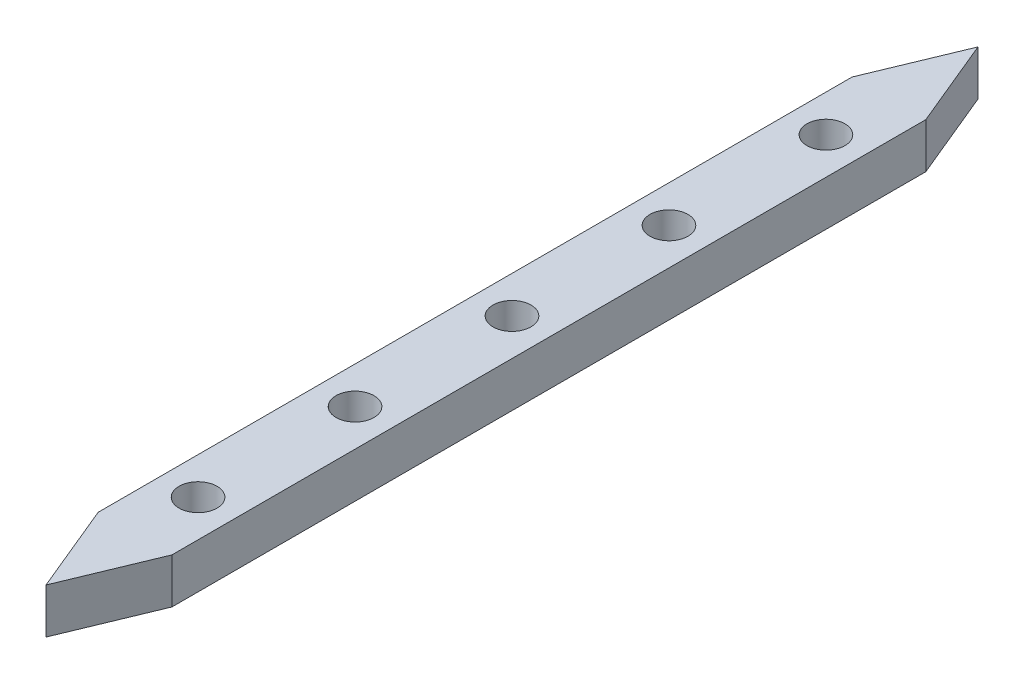
ISO-10303-21;
HEADER;
FILE_DESCRIPTION(('STEP AP214'),'2;1');
FILE_NAME('part.step','',(''),(''),'','','');
FILE_SCHEMA(('AUTOMOTIVE_DESIGN { 1 0 10303 214 1 1 1 1 }'));
ENDSEC;
DATA;
#1=APPLICATION_CONTEXT('core data for automotive mechanical design processes');
#2=APPLICATION_PROTOCOL_DEFINITION('international standard','automotive_design',2000,#1);
#3=PRODUCT_CONTEXT('',#1,'mechanical');
#4=PRODUCT('Part','Part','',(#3));
#5=PRODUCT_RELATED_PRODUCT_CATEGORY('part','',(#4));
#6=PRODUCT_DEFINITION_FORMATION('','',#4);
#7=PRODUCT_DEFINITION_CONTEXT('part definition',#1,'design');
#8=PRODUCT_DEFINITION('design','',#6,#7);
#9=PRODUCT_DEFINITION_SHAPE('','',#8);
#10=(LENGTH_UNIT() NAMED_UNIT(*) SI_UNIT(.MILLI.,.METRE.));
#11=(NAMED_UNIT(*) PLANE_ANGLE_UNIT() SI_UNIT($,.RADIAN.));
#12=(NAMED_UNIT(*) SI_UNIT($,.STERADIAN.) SOLID_ANGLE_UNIT());
#13=UNCERTAINTY_MEASURE_WITH_UNIT(LENGTH_MEASURE(1.E-05),#10,'distance_accuracy_value','');
#14=(GEOMETRIC_REPRESENTATION_CONTEXT(3) GLOBAL_UNCERTAINTY_ASSIGNED_CONTEXT((#13)) GLOBAL_UNIT_ASSIGNED_CONTEXT((#10,
#11,#12)) REPRESENTATION_CONTEXT('',''));
#15=CARTESIAN_POINT('',(0.,0.,0.));
#16=DIRECTION('',(0.,0.,1.));
#17=DIRECTION('',(1.,0.,0.));
#18=AXIS2_PLACEMENT_3D('',#15,#16,#17);
#19=CARTESIAN_POINT('',(0.,5.842,-60.325));
#20=DIRECTION('',(-0.923879532511286,0.,0.382683432365091));
#21=DIRECTION('',(0.382683432365091,0.,0.923879532511286));
#22=AXIS2_PLACEMENT_3D('',#19,#20,#21);
#23=PLANE('',#22);
#24=DIRECTION('',(-0.382683432365091,0.,-0.923879532511286));
#25=VECTOR('',#24,1.);
#26=CARTESIAN_POINT('',(0.,0.,-60.325));
#27=LINE('',#26,#25);
#28=CARTESIAN_POINT('',(4.77519999999999,0.,-48.7966473969561));
#29=VERTEX_POINT('',#28);
#30=CARTESIAN_POINT('',(0.,0.,-60.325));
#31=VERTEX_POINT('',#30);
#32=EDGE_CURVE('E119',#29,#31,#27,.T.);
#33=ORIENTED_EDGE('',*,*,#32,.T.);
#34=DIRECTION('',(0.,-1.,0.));
#35=VECTOR('',#34,1.);
#36=CARTESIAN_POINT('',(0.,5.842,-60.325));
#37=LINE('',#36,#35);
#38=CARTESIAN_POINT('',(0.,5.842,-60.325));
#39=VERTEX_POINT('',#38);
#40=EDGE_CURVE('E11',#39,#31,#37,.T.);
#41=ORIENTED_EDGE('',*,*,#40,.F.);
#42=DIRECTION('',(-0.382683432365091,0.,-0.923879532511286));
#43=VECTOR('',#42,1.);
#44=CARTESIAN_POINT('',(0.,5.842,-60.325));
#45=LINE('',#44,#43);
#46=CARTESIAN_POINT('',(4.77519999999999,5.842,-48.7966473969561));
#47=VERTEX_POINT('',#46);
#48=EDGE_CURVE('E130',#47,#39,#45,.T.);
#49=ORIENTED_EDGE('',*,*,#48,.F.);
#50=DIRECTION('',(0.,-1.,0.));
#51=VECTOR('',#50,1.);
#52=CARTESIAN_POINT('',(4.77519999999999,5.842,-48.7966473969561));
#53=LINE('',#52,#51);
#54=EDGE_CURVE('E115',#47,#29,#53,.T.);
#55=ORIENTED_EDGE('',*,*,#54,.T.);
#56=EDGE_LOOP('',(#33,#41,#49,#55));
#57=FACE_BOUND('',#56,.T.);
#58=ADVANCED_FACE('F35',(#57),#23,.F.);
#59=CARTESIAN_POINT('',(0.,5.842,-60.325));
#60=DIRECTION('',(0.923879532511286,0.,0.382683432365091));
#61=DIRECTION('',(0.382683432365091,0.,-0.923879532511286));
#62=AXIS2_PLACEMENT_3D('',#59,#60,#61);
#63=PLANE('',#62);
#64=DIRECTION('',(-0.382683432365091,0.,0.923879532511286));
#65=VECTOR('',#64,1.);
#66=CARTESIAN_POINT('',(0.,0.,-60.325));
#67=LINE('',#66,#65);
#68=CARTESIAN_POINT('',(-4.77519999999999,0.,-48.7966473969561));
#69=VERTEX_POINT('',#68);
#70=EDGE_CURVE('E122',#31,#69,#67,.T.);
#71=ORIENTED_EDGE('',*,*,#70,.T.);
#72=DIRECTION('',(0.,-1.,0.));
#73=VECTOR('',#72,1.);
#74=CARTESIAN_POINT('',(-4.77519999999999,5.842,-48.7966473969561));
#75=LINE('',#74,#73);
#76=CARTESIAN_POINT('',(-4.77519999999999,5.842,-48.7966473969561));
#77=VERTEX_POINT('',#76);
#78=EDGE_CURVE('E43',#77,#69,#75,.T.);
#79=ORIENTED_EDGE('',*,*,#78,.F.);
#80=DIRECTION('',(-0.382683432365091,0.,0.923879532511286));
#81=VECTOR('',#80,1.);
#82=CARTESIAN_POINT('',(0.,5.842,-60.325));
#83=LINE('',#82,#81);
#84=EDGE_CURVE('E88',#39,#77,#83,.T.);
#85=ORIENTED_EDGE('',*,*,#84,.F.);
#86=ORIENTED_EDGE('',*,*,#40,.T.);
#87=EDGE_LOOP('',(#71,#79,#85,#86));
#88=FACE_BOUND('',#87,.T.);
#89=ADVANCED_FACE('F155',(#88),#63,.F.);
#90=CARTESIAN_POINT('',(-4.77519999999999,5.842,-48.7966473969561));
#91=DIRECTION('',(1.,0.,0.));
#92=DIRECTION('',(0.,0.,-1.));
#93=AXIS2_PLACEMENT_3D('',#90,#91,#92);
#94=PLANE('',#93);
#95=DIRECTION('',(0.,0.,1.));
#96=VECTOR('',#95,1.);
#97=CARTESIAN_POINT('',(-4.77519999999999,0.,-48.7966473969561));
#98=LINE('',#97,#96);
#99=CARTESIAN_POINT('',(-4.77519999999999,0.,48.7966473969561));
#100=VERTEX_POINT('',#99);
#101=EDGE_CURVE('E125',#69,#100,#98,.T.);
#102=ORIENTED_EDGE('',*,*,#101,.T.);
#103=DIRECTION('',(0.,-1.,0.));
#104=VECTOR('',#103,1.);
#105=CARTESIAN_POINT('',(-4.77519999999999,5.842,48.7966473969561));
#106=LINE('',#105,#104);
#107=CARTESIAN_POINT('',(-4.77519999999999,5.842,48.7966473969561));
#108=VERTEX_POINT('',#107);
#109=EDGE_CURVE('E110',#108,#100,#106,.T.);
#110=ORIENTED_EDGE('',*,*,#109,.F.);
#111=DIRECTION('',(0.,0.,1.));
#112=VECTOR('',#111,1.);
#113=CARTESIAN_POINT('',(-4.77519999999999,5.842,-48.7966473969561));
#114=LINE('',#113,#112);
#115=EDGE_CURVE('E101',#77,#108,#114,.T.);
#116=ORIENTED_EDGE('',*,*,#115,.F.);
#117=ORIENTED_EDGE('',*,*,#78,.T.);
#118=EDGE_LOOP('',(#102,#110,#116,#117));
#119=FACE_BOUND('',#118,.T.);
#120=ADVANCED_FACE('F136',(#119),#94,.F.);
#121=CARTESIAN_POINT('',(0.,5.842,60.325));
#122=DIRECTION('',(0.923879532511286,0.,-0.382683432365091));
#123=DIRECTION('',(-0.382683432365091,0.,-0.923879532511286));
#124=AXIS2_PLACEMENT_3D('',#121,#122,#123);
#125=PLANE('',#124);
#126=DIRECTION('',(0.382683432365091,0.,0.923879532511286));
#127=VECTOR('',#126,1.);
#128=CARTESIAN_POINT('',(0.,0.,60.325));
#129=LINE('',#128,#127);
#130=CARTESIAN_POINT('',(0.,0.,60.325));
#131=VERTEX_POINT('',#130);
#132=EDGE_CURVE('E109',#100,#131,#129,.T.);
#133=ORIENTED_EDGE('',*,*,#132,.T.);
#134=DIRECTION('',(0.,-1.,0.));
#135=VECTOR('',#134,1.);
#136=CARTESIAN_POINT('',(0.,5.842,60.325));
#137=LINE('',#136,#135);
#138=CARTESIAN_POINT('',(0.,5.842,60.325));
#139=VERTEX_POINT('',#138);
#140=EDGE_CURVE('E106',#139,#131,#137,.T.);
#141=ORIENTED_EDGE('',*,*,#140,.F.);
#142=DIRECTION('',(0.382683432365091,0.,0.923879532511286));
#143=VECTOR('',#142,1.);
#144=CARTESIAN_POINT('',(0.,5.842,60.325));
#145=LINE('',#144,#143);
#146=EDGE_CURVE('E95',#108,#139,#145,.T.);
#147=ORIENTED_EDGE('',*,*,#146,.F.);
#148=ORIENTED_EDGE('',*,*,#109,.T.);
#149=EDGE_LOOP('',(#133,#141,#147,#148));
#150=FACE_BOUND('',#149,.T.);
#151=ADVANCED_FACE('F107',(#150),#125,.F.);
#152=CARTESIAN_POINT('',(0.,5.842,60.325));
#153=DIRECTION('',(-0.923879532511286,0.,-0.382683432365091));
#154=DIRECTION('',(-0.382683432365091,0.,0.923879532511286));
#155=AXIS2_PLACEMENT_3D('',#152,#153,#154);
#156=PLANE('',#155);
#157=DIRECTION('',(0.382683432365091,0.,-0.923879532511286));
#158=VECTOR('',#157,1.);
#159=CARTESIAN_POINT('',(0.,0.,60.325));
#160=LINE('',#159,#158);
#161=CARTESIAN_POINT('',(4.77519999999999,0.,48.7966473969561));
#162=VERTEX_POINT('',#161);
#163=EDGE_CURVE('E74',#131,#162,#160,.T.);
#164=ORIENTED_EDGE('',*,*,#163,.T.);
#165=DIRECTION('',(0.,-1.,0.));
#166=VECTOR('',#165,1.);
#167=CARTESIAN_POINT('',(4.77519999999999,5.842,48.7966473969561));
#168=LINE('',#167,#166);
#169=CARTESIAN_POINT('',(4.77519999999999,5.842,48.7966473969561));
#170=VERTEX_POINT('',#169);
#171=EDGE_CURVE('E111',#170,#162,#168,.T.);
#172=ORIENTED_EDGE('',*,*,#171,.F.);
#173=DIRECTION('',(0.382683432365091,0.,-0.923879532511286));
#174=VECTOR('',#173,1.);
#175=CARTESIAN_POINT('',(0.,5.842,60.325));
#176=LINE('',#175,#174);
#177=EDGE_CURVE('E99',#139,#170,#176,.T.);
#178=ORIENTED_EDGE('',*,*,#177,.F.);
#179=ORIENTED_EDGE('',*,*,#140,.T.);
#180=EDGE_LOOP('',(#164,#172,#178,#179));
#181=FACE_BOUND('',#180,.T.);
#182=ADVANCED_FACE('F113',(#181),#156,.F.);
#183=CARTESIAN_POINT('',(4.77519999999999,5.842,-48.7966473969561));
#184=DIRECTION('',(-1.,0.,0.));
#185=DIRECTION('',(0.,0.,1.));
#186=AXIS2_PLACEMENT_3D('',#183,#184,#185);
#187=PLANE('',#186);
#188=DIRECTION('',(0.,0.,-1.));
#189=VECTOR('',#188,1.);
#190=CARTESIAN_POINT('',(4.77519999999999,0.,-48.7966473969561));
#191=LINE('',#190,#189);
#192=EDGE_CURVE('E80',#162,#29,#191,.T.);
#193=ORIENTED_EDGE('',*,*,#192,.T.);
#194=ORIENTED_EDGE('',*,*,#54,.F.);
#195=DIRECTION('',(0.,0.,-1.));
#196=VECTOR('',#195,1.);
#197=CARTESIAN_POINT('',(4.77519999999999,5.842,-48.7966473969561));
#198=LINE('',#197,#196);
#199=EDGE_CURVE('E51',#170,#47,#198,.T.);
#200=ORIENTED_EDGE('',*,*,#199,.F.);
#201=ORIENTED_EDGE('',*,*,#171,.T.);
#202=EDGE_LOOP('',(#193,#194,#200,#201));
#203=FACE_BOUND('',#202,.T.);
#204=ADVANCED_FACE('F143',(#203),#187,.F.);
#205=CARTESIAN_POINT('',(0.,5.842,0.));
#206=DIRECTION('',(0.,1.,0.));
#207=DIRECTION('',(0.,0.,1.));
#208=AXIS2_PLACEMENT_3D('',#205,#206,#207);
#209=PLANE('',#208);
#210=CARTESIAN_POINT('',(0.,5.842,-20.32));
#211=DIRECTION('',(0.,1.,0.));
#212=DIRECTION('',(0.,0.,1.));
#213=AXIS2_PLACEMENT_3D('',#210,#211,#212);
#214=CIRCLE('',#213,2.45745);
#215=CARTESIAN_POINT('',(0.,5.842,-17.86255));
#216=VERTEX_POINT('',#215);
#217=EDGE_CURVE('E261',#216,#216,#214,.T.);
#218=ORIENTED_EDGE('',*,*,#217,.F.);
#219=EDGE_LOOP('',(#218));
#220=FACE_BOUND('',#219,.T.);
#221=CARTESIAN_POINT('',(0.,5.842,-40.64));
#222=DIRECTION('',(0.,1.,0.));
#223=DIRECTION('',(0.,0.,1.));
#224=AXIS2_PLACEMENT_3D('',#221,#222,#223);
#225=CIRCLE('',#224,2.45745);
#226=CARTESIAN_POINT('',(0.,5.842,-38.18255));
#227=VERTEX_POINT('',#226);
#228=EDGE_CURVE('E263',#227,#227,#225,.T.);
#229=ORIENTED_EDGE('',*,*,#228,.F.);
#230=EDGE_LOOP('',(#229));
#231=FACE_BOUND('',#230,.T.);
#232=CARTESIAN_POINT('',(0.,5.842,0.));
#233=DIRECTION('',(0.,1.,0.));
#234=DIRECTION('',(0.,0.,1.));
#235=AXIS2_PLACEMENT_3D('',#232,#233,#234);
#236=CIRCLE('',#235,2.45745);
#237=CARTESIAN_POINT('',(0.,5.842,2.45745));
#238=VERTEX_POINT('',#237);
#239=EDGE_CURVE('E271',#238,#238,#236,.T.);
#240=ORIENTED_EDGE('',*,*,#239,.F.);
#241=EDGE_LOOP('',(#240));
#242=FACE_BOUND('',#241,.T.);
#243=CARTESIAN_POINT('',(0.,5.842,20.32));
#244=DIRECTION('',(0.,1.,0.));
#245=DIRECTION('',(0.,0.,1.));
#246=AXIS2_PLACEMENT_3D('',#243,#244,#245);
#247=CIRCLE('',#246,2.45745);
#248=CARTESIAN_POINT('',(0.,5.842,22.77745));
#249=VERTEX_POINT('',#248);
#250=EDGE_CURVE('E277',#249,#249,#247,.T.);
#251=ORIENTED_EDGE('',*,*,#250,.F.);
#252=EDGE_LOOP('',(#251));
#253=FACE_BOUND('',#252,.T.);
#254=CARTESIAN_POINT('',(0.,5.842,40.64));
#255=DIRECTION('',(0.,1.,0.));
#256=DIRECTION('',(0.,0.,1.));
#257=AXIS2_PLACEMENT_3D('',#254,#255,#256);
#258=CIRCLE('',#257,2.45745);
#259=CARTESIAN_POINT('',(0.,5.842,43.09745));
#260=VERTEX_POINT('',#259);
#261=EDGE_CURVE('E283',#260,#260,#258,.T.);
#262=ORIENTED_EDGE('',*,*,#261,.F.);
#263=EDGE_LOOP('',(#262));
#264=FACE_BOUND('',#263,.T.);
#265=ORIENTED_EDGE('',*,*,#48,.T.);
#266=ORIENTED_EDGE('',*,*,#84,.T.);
#267=ORIENTED_EDGE('',*,*,#115,.T.);
#268=ORIENTED_EDGE('',*,*,#146,.T.);
#269=ORIENTED_EDGE('',*,*,#177,.T.);
#270=ORIENTED_EDGE('',*,*,#199,.T.);
#271=EDGE_LOOP('',(#265,#266,#267,#268,#269,#270));
#272=FACE_BOUND('',#271,.T.);
#273=ADVANCED_FACE('F97',(#220,#231,#242,#253,#264,#272),#209,.T.);
#274=CARTESIAN_POINT('',(0.,0.,0.));
#275=DIRECTION('',(0.,1.,0.));
#276=DIRECTION('',(0.,0.,1.));
#277=AXIS2_PLACEMENT_3D('',#274,#275,#276);
#278=PLANE('',#277);
#279=CARTESIAN_POINT('',(0.,0.,-20.32));
#280=DIRECTION('',(0.,1.,0.));
#281=DIRECTION('',(0.,0.,1.));
#282=AXIS2_PLACEMENT_3D('',#279,#280,#281);
#283=CIRCLE('',#282,2.45745);
#284=CARTESIAN_POINT('',(0.,0.,-17.86255));
#285=VERTEX_POINT('',#284);
#286=EDGE_CURVE('E258',#285,#285,#283,.T.);
#287=ORIENTED_EDGE('',*,*,#286,.T.);
#288=EDGE_LOOP('',(#287));
#289=FACE_BOUND('',#288,.T.);
#290=CARTESIAN_POINT('',(0.,0.,-40.64));
#291=DIRECTION('',(0.,1.,0.));
#292=DIRECTION('',(0.,0.,1.));
#293=AXIS2_PLACEMENT_3D('',#290,#291,#292);
#294=CIRCLE('',#293,2.45745);
#295=CARTESIAN_POINT('',(0.,0.,-38.18255));
#296=VERTEX_POINT('',#295);
#297=EDGE_CURVE('E268',#296,#296,#294,.T.);
#298=ORIENTED_EDGE('',*,*,#297,.T.);
#299=EDGE_LOOP('',(#298));
#300=FACE_BOUND('',#299,.T.);
#301=CARTESIAN_POINT('',(0.,0.,0.));
#302=DIRECTION('',(0.,1.,0.));
#303=DIRECTION('',(0.,0.,1.));
#304=AXIS2_PLACEMENT_3D('',#301,#302,#303);
#305=CIRCLE('',#304,2.45745);
#306=CARTESIAN_POINT('',(0.,0.,2.45745));
#307=VERTEX_POINT('',#306);
#308=EDGE_CURVE('E274',#307,#307,#305,.T.);
#309=ORIENTED_EDGE('',*,*,#308,.T.);
#310=EDGE_LOOP('',(#309));
#311=FACE_BOUND('',#310,.T.);
#312=CARTESIAN_POINT('',(0.,0.,20.32));
#313=DIRECTION('',(0.,1.,0.));
#314=DIRECTION('',(0.,0.,1.));
#315=AXIS2_PLACEMENT_3D('',#312,#313,#314);
#316=CIRCLE('',#315,2.45745);
#317=CARTESIAN_POINT('',(0.,0.,22.77745));
#318=VERTEX_POINT('',#317);
#319=EDGE_CURVE('E280',#318,#318,#316,.T.);
#320=ORIENTED_EDGE('',*,*,#319,.T.);
#321=EDGE_LOOP('',(#320));
#322=FACE_BOUND('',#321,.T.);
#323=CARTESIAN_POINT('',(0.,0.,40.64));
#324=DIRECTION('',(0.,1.,0.));
#325=DIRECTION('',(0.,0.,1.));
#326=AXIS2_PLACEMENT_3D('',#323,#324,#325);
#327=CIRCLE('',#326,2.45745);
#328=CARTESIAN_POINT('',(0.,0.,43.09745));
#329=VERTEX_POINT('',#328);
#330=EDGE_CURVE('E123',#329,#329,#327,.T.);
#331=ORIENTED_EDGE('',*,*,#330,.T.);
#332=EDGE_LOOP('',(#331));
#333=FACE_BOUND('',#332,.T.);
#334=ORIENTED_EDGE('',*,*,#32,.F.);
#335=ORIENTED_EDGE('',*,*,#192,.F.);
#336=ORIENTED_EDGE('',*,*,#163,.F.);
#337=ORIENTED_EDGE('',*,*,#132,.F.);
#338=ORIENTED_EDGE('',*,*,#101,.F.);
#339=ORIENTED_EDGE('',*,*,#70,.F.);
#340=EDGE_LOOP('',(#334,#335,#336,#337,#338,#339));
#341=FACE_BOUND('',#340,.T.);
#342=ADVANCED_FACE('F139',(#289,#300,#311,#322,#333,#341),#278,.F.);
#343=CARTESIAN_POINT('',(0.,5.842,40.64));
#344=DIRECTION('',(0.,1.,0.));
#345=DIRECTION('',(0.,0.,1.));
#346=AXIS2_PLACEMENT_3D('',#343,#344,#345);
#347=CYLINDRICAL_SURFACE('',#346,2.45745);
#348=ORIENTED_EDGE('',*,*,#330,.F.);
#349=EDGE_LOOP('',(#348));
#350=FACE_BOUND('',#349,.T.);
#351=ORIENTED_EDGE('',*,*,#261,.T.);
#352=EDGE_LOOP('',(#351));
#353=FACE_BOUND('',#352,.T.);
#354=ADVANCED_FACE('F192',(#350,#353),#347,.F.);
#355=CARTESIAN_POINT('',(0.,5.842,20.32));
#356=DIRECTION('',(0.,1.,0.));
#357=DIRECTION('',(0.,0.,1.));
#358=AXIS2_PLACEMENT_3D('',#355,#356,#357);
#359=CYLINDRICAL_SURFACE('',#358,2.45745);
#360=ORIENTED_EDGE('',*,*,#319,.F.);
#361=EDGE_LOOP('',(#360));
#362=FACE_BOUND('',#361,.T.);
#363=ORIENTED_EDGE('',*,*,#250,.T.);
#364=EDGE_LOOP('',(#363));
#365=FACE_BOUND('',#364,.T.);
#366=ADVANCED_FACE('F202',(#362,#365),#359,.F.);
#367=CARTESIAN_POINT('',(0.,5.842,0.));
#368=DIRECTION('',(0.,1.,0.));
#369=DIRECTION('',(0.,0.,1.));
#370=AXIS2_PLACEMENT_3D('',#367,#368,#369);
#371=CYLINDRICAL_SURFACE('',#370,2.45745);
#372=ORIENTED_EDGE('',*,*,#308,.F.);
#373=EDGE_LOOP('',(#372));
#374=FACE_BOUND('',#373,.T.);
#375=ORIENTED_EDGE('',*,*,#239,.T.);
#376=EDGE_LOOP('',(#375));
#377=FACE_BOUND('',#376,.T.);
#378=ADVANCED_FACE('F214',(#374,#377),#371,.F.);
#379=CARTESIAN_POINT('',(0.,5.842,-40.64));
#380=DIRECTION('',(0.,1.,0.));
#381=DIRECTION('',(0.,0.,1.));
#382=AXIS2_PLACEMENT_3D('',#379,#380,#381);
#383=CYLINDRICAL_SURFACE('',#382,2.45745);
#384=ORIENTED_EDGE('',*,*,#297,.F.);
#385=EDGE_LOOP('',(#384));
#386=FACE_BOUND('',#385,.T.);
#387=ORIENTED_EDGE('',*,*,#228,.T.);
#388=EDGE_LOOP('',(#387));
#389=FACE_BOUND('',#388,.T.);
#390=ADVANCED_FACE('F225',(#386,#389),#383,.F.);
#391=CARTESIAN_POINT('',(0.,5.842,-20.32));
#392=DIRECTION('',(0.,1.,0.));
#393=DIRECTION('',(0.,0.,1.));
#394=AXIS2_PLACEMENT_3D('',#391,#392,#393);
#395=CYLINDRICAL_SURFACE('',#394,2.45745);
#396=ORIENTED_EDGE('',*,*,#286,.F.);
#397=EDGE_LOOP('',(#396));
#398=FACE_BOUND('',#397,.T.);
#399=ORIENTED_EDGE('',*,*,#217,.T.);
#400=EDGE_LOOP('',(#399));
#401=FACE_BOUND('',#400,.T.);
#402=ADVANCED_FACE('F236',(#398,#401),#395,.F.);
#403=CLOSED_SHELL('',(#58,#89,#120,#151,#182,#204,#273,#342,#354,#366,#378,#390,#402));
#404=MANIFOLD_SOLID_BREP('B2',#403);
#405=ADVANCED_BREP_SHAPE_REPRESENTATION('',(#18,#404),#14);
#406=SHAPE_DEFINITION_REPRESENTATION(#9,#405);
ENDSEC;
END-ISO-10303-21;
